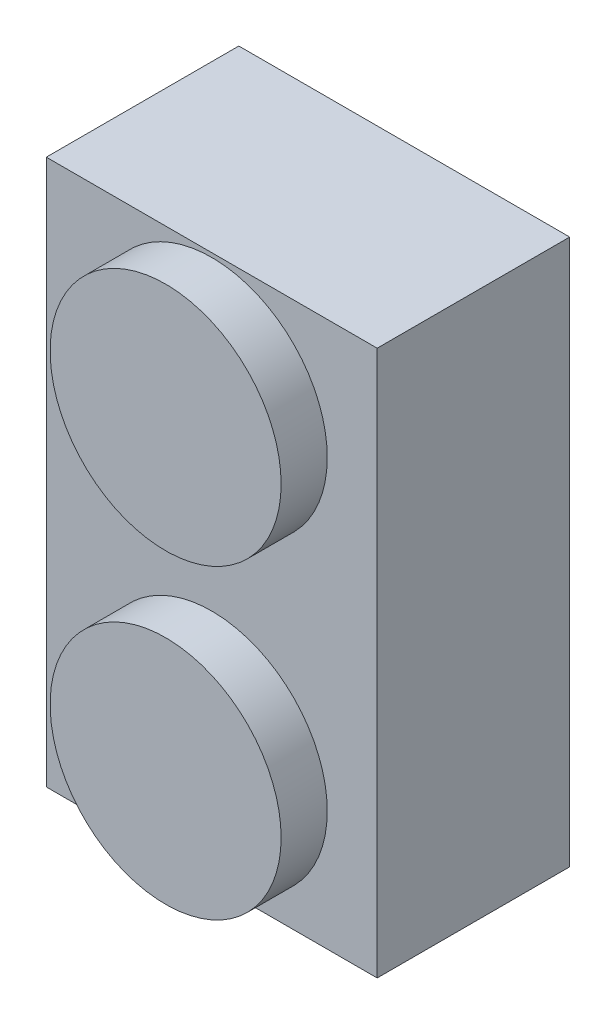
ISO-10303-21;
HEADER;
FILE_DESCRIPTION(('STEP AP214'),'2;1');
FILE_NAME('part.step','',(''),(''),'','','');
FILE_SCHEMA(('AUTOMOTIVE_DESIGN { 1 0 10303 214 1 1 1 1 }'));
ENDSEC;
DATA;
#1=APPLICATION_CONTEXT('core data for automotive mechanical design processes');
#2=APPLICATION_PROTOCOL_DEFINITION('international standard','automotive_design',2000,#1);
#3=PRODUCT_CONTEXT('',#1,'mechanical');
#4=PRODUCT('Part','Part','',(#3));
#5=PRODUCT_RELATED_PRODUCT_CATEGORY('part','',(#4));
#6=PRODUCT_DEFINITION_FORMATION('','',#4);
#7=PRODUCT_DEFINITION_CONTEXT('part definition',#1,'design');
#8=PRODUCT_DEFINITION('design','',#6,#7);
#9=PRODUCT_DEFINITION_SHAPE('','',#8);
#10=(LENGTH_UNIT() NAMED_UNIT(*) SI_UNIT(.MILLI.,.METRE.));
#11=(NAMED_UNIT(*) PLANE_ANGLE_UNIT() SI_UNIT($,.RADIAN.));
#12=(NAMED_UNIT(*) SI_UNIT($,.STERADIAN.) SOLID_ANGLE_UNIT());
#13=UNCERTAINTY_MEASURE_WITH_UNIT(LENGTH_MEASURE(1.E-05),#10,'distance_accuracy_value','');
#14=(GEOMETRIC_REPRESENTATION_CONTEXT(3) GLOBAL_UNCERTAINTY_ASSIGNED_CONTEXT((#13)) GLOBAL_UNIT_ASSIGNED_CONTEXT((#10,
#11,#12)) REPRESENTATION_CONTEXT('',''));
#15=CARTESIAN_POINT('',(0.,0.,0.));
#16=DIRECTION('',(0.,0.,1.));
#17=DIRECTION('',(1.,0.,0.));
#18=AXIS2_PLACEMENT_3D('',#15,#16,#17);
#19=CARTESIAN_POINT('',(0.,0.,30.226));
#20=DIRECTION('',(0.,0.,1.));
#21=DIRECTION('',(1.,0.,0.));
#22=AXIS2_PLACEMENT_3D('',#19,#20,#21);
#23=PLANE('',#22);
#24=CARTESIAN_POINT('',(20.955,53.9369,30.226));
#25=DIRECTION('',(0.,0.,1.));
#26=DIRECTION('',(1.,0.,0.));
#27=AXIS2_PLACEMENT_3D('',#24,#25,#26);
#28=CIRCLE('',#27,14.6304);
#29=CARTESIAN_POINT('',(35.5854,53.9369,30.226));
#30=VERTEX_POINT('',#29);
#31=EDGE_CURVE('E20',#30,#30,#28,.F.);
#32=ORIENTED_EDGE('',*,*,#31,.F.);
#33=EDGE_LOOP('',(#32));
#34=FACE_BOUND('',#33,.T.);
#35=ADVANCED_FACE('F17',(#34),#23,.T.);
#36=CARTESIAN_POINT('',(0.,0.,30.226));
#37=DIRECTION('',(0.,0.,1.));
#38=DIRECTION('',(1.,0.,0.));
#39=AXIS2_PLACEMENT_3D('',#36,#37,#38);
#40=PLANE('',#39);
#41=CARTESIAN_POINT('',(20.955,15.1511,30.226));
#42=DIRECTION('',(0.,0.,1.));
#43=DIRECTION('',(1.,0.,0.));
#44=AXIS2_PLACEMENT_3D('',#41,#42,#43);
#45=CIRCLE('',#44,14.6304);
#46=CARTESIAN_POINT('',(35.5854,15.1511,30.226));
#47=VERTEX_POINT('',#46);
#48=EDGE_CURVE('E88',#47,#47,#45,.F.);
#49=ORIENTED_EDGE('',*,*,#48,.F.);
#50=EDGE_LOOP('',(#49));
#51=FACE_BOUND('',#50,.T.);
#52=ADVANCED_FACE('F99',(#51),#40,.T.);
#53=CARTESIAN_POINT('',(20.955,53.9369,24.384));
#54=DIRECTION('',(0.,0.,1.));
#55=DIRECTION('',(1.,0.,0.));
#56=AXIS2_PLACEMENT_3D('',#53,#54,#55);
#57=CYLINDRICAL_SURFACE('',#56,14.6304);
#58=ORIENTED_EDGE('',*,*,#31,.T.);
#59=EDGE_LOOP('',(#58));
#60=FACE_BOUND('',#59,.T.);
#61=CARTESIAN_POINT('',(20.955,53.9369,24.384));
#62=DIRECTION('',(0.,0.,1.));
#63=DIRECTION('',(1.,0.,0.));
#64=AXIS2_PLACEMENT_3D('',#61,#62,#63);
#65=CIRCLE('',#64,14.6304);
#66=CARTESIAN_POINT('',(35.5854,53.9369,24.384));
#67=VERTEX_POINT('',#66);
#68=EDGE_CURVE('E86',#67,#67,#65,.F.);
#69=ORIENTED_EDGE('',*,*,#68,.F.);
#70=EDGE_LOOP('',(#69));
#71=FACE_BOUND('',#70,.T.);
#72=ADVANCED_FACE('F95',(#60,#71),#57,.T.);
#73=CARTESIAN_POINT('',(20.955,15.1511,24.384));
#74=DIRECTION('',(0.,0.,1.));
#75=DIRECTION('',(1.,0.,0.));
#76=AXIS2_PLACEMENT_3D('',#73,#74,#75);
#77=CYLINDRICAL_SURFACE('',#76,14.6304);
#78=ORIENTED_EDGE('',*,*,#48,.T.);
#79=EDGE_LOOP('',(#78));
#80=FACE_BOUND('',#79,.T.);
#81=CARTESIAN_POINT('',(20.955,15.1511,24.384));
#82=DIRECTION('',(0.,0.,1.));
#83=DIRECTION('',(1.,0.,0.));
#84=AXIS2_PLACEMENT_3D('',#81,#82,#83);
#85=CIRCLE('',#84,14.6304);
#86=CARTESIAN_POINT('',(35.5854,15.1511,24.384));
#87=VERTEX_POINT('',#86);
#88=EDGE_CURVE('E75',#87,#87,#85,.F.);
#89=ORIENTED_EDGE('',*,*,#88,.F.);
#90=EDGE_LOOP('',(#89));
#91=FACE_BOUND('',#90,.T.);
#92=ADVANCED_FACE('F125',(#80,#91),#77,.T.);
#93=CARTESIAN_POINT('',(0.,0.,24.384));
#94=DIRECTION('',(0.,0.,1.));
#95=DIRECTION('',(1.,0.,0.));
#96=AXIS2_PLACEMENT_3D('',#93,#94,#95);
#97=PLANE('',#96);
#98=ORIENTED_EDGE('',*,*,#88,.T.);
#99=EDGE_LOOP('',(#98));
#100=FACE_BOUND('',#99,.T.);
#101=ORIENTED_EDGE('',*,*,#68,.T.);
#102=EDGE_LOOP('',(#101));
#103=FACE_BOUND('',#102,.T.);
#104=DIRECTION('',(1.,0.,0.));
#105=VECTOR('',#104,1.);
#106=CARTESIAN_POINT('',(41.91,69.088,24.384));
#107=LINE('',#106,#105);
#108=CARTESIAN_POINT('',(0.,69.088,24.384));
#109=VERTEX_POINT('',#108);
#110=CARTESIAN_POINT('',(41.91,69.088,24.384));
#111=VERTEX_POINT('',#110);
#112=EDGE_CURVE('E71',#109,#111,#107,.T.);
#113=ORIENTED_EDGE('',*,*,#112,.F.);
#114=DIRECTION('',(0.,1.,0.));
#115=VECTOR('',#114,1.);
#116=CARTESIAN_POINT('',(0.,69.088,24.384));
#117=LINE('',#116,#115);
#118=CARTESIAN_POINT('',(0.,0.,24.384));
#119=VERTEX_POINT('',#118);
#120=EDGE_CURVE('E67',#119,#109,#117,.T.);
#121=ORIENTED_EDGE('',*,*,#120,.F.);
#122=DIRECTION('',(1.,0.,0.));
#123=VECTOR('',#122,1.);
#124=CARTESIAN_POINT('',(0.,0.,24.384));
#125=LINE('',#124,#123);
#126=CARTESIAN_POINT('',(41.91,0.,24.384));
#127=VERTEX_POINT('',#126);
#128=EDGE_CURVE('E58',#127,#119,#125,.F.);
#129=ORIENTED_EDGE('',*,*,#128,.F.);
#130=DIRECTION('',(0.,1.,0.));
#131=VECTOR('',#130,1.);
#132=CARTESIAN_POINT('',(41.91,0.,24.384));
#133=LINE('',#132,#131);
#134=EDGE_CURVE('E53',#111,#127,#133,.F.);
#135=ORIENTED_EDGE('',*,*,#134,.F.);
#136=EDGE_LOOP('',(#113,#121,#129,#135));
#137=FACE_BOUND('',#136,.T.);
#138=ADVANCED_FACE('F70',(#100,#103,#137),#97,.T.);
#139=CARTESIAN_POINT('',(0.,69.088,0.));
#140=DIRECTION('',(-1.,0.,0.));
#141=DIRECTION('',(0.,0.,1.));
#142=AXIS2_PLACEMENT_3D('',#139,#140,#141);
#143=PLANE('',#142);
#144=DIRECTION('',(0.,0.,1.));
#145=VECTOR('',#144,1.);
#146=CARTESIAN_POINT('',(0.,69.088,0.));
#147=LINE('',#146,#145);
#148=CARTESIAN_POINT('',(0.,69.088,0.));
#149=VERTEX_POINT('',#148);
#150=EDGE_CURVE('E213',#149,#109,#147,.T.);
#151=ORIENTED_EDGE('',*,*,#150,.F.);
#152=DIRECTION('',(0.,1.,0.));
#153=VECTOR('',#152,1.);
#154=CARTESIAN_POINT('',(0.,0.,0.));
#155=LINE('',#154,#153);
#156=CARTESIAN_POINT('',(0.,0.,0.));
#157=VERTEX_POINT('',#156);
#158=EDGE_CURVE('E79',#149,#157,#155,.F.);
#159=ORIENTED_EDGE('',*,*,#158,.T.);
#160=DIRECTION('',(0.,0.,-1.));
#161=VECTOR('',#160,1.);
#162=CARTESIAN_POINT('',(0.,0.,0.));
#163=LINE('',#162,#161);
#164=EDGE_CURVE('E63',#119,#157,#163,.T.);
#165=ORIENTED_EDGE('',*,*,#164,.F.);
#166=ORIENTED_EDGE('',*,*,#120,.T.);
#167=EDGE_LOOP('',(#151,#159,#165,#166));
#168=FACE_BOUND('',#167,.T.);
#169=ADVANCED_FACE('F78',(#168),#143,.T.);
#170=CARTESIAN_POINT('',(0.,0.,0.));
#171=DIRECTION('',(0.,-1.,0.));
#172=DIRECTION('',(0.,0.,-1.));
#173=AXIS2_PLACEMENT_3D('',#170,#171,#172);
#174=PLANE('',#173);
#175=ORIENTED_EDGE('',*,*,#164,.T.);
#176=DIRECTION('',(1.,0.,0.));
#177=VECTOR('',#176,1.);
#178=CARTESIAN_POINT('',(0.,0.,0.));
#179=LINE('',#178,#177);
#180=CARTESIAN_POINT('',(41.91,0.,0.));
#181=VERTEX_POINT('',#180);
#182=EDGE_CURVE('E214',#157,#181,#179,.T.);
#183=ORIENTED_EDGE('',*,*,#182,.T.);
#184=DIRECTION('',(0.,0.,-1.));
#185=VECTOR('',#184,1.);
#186=CARTESIAN_POINT('',(41.91,0.,0.));
#187=LINE('',#186,#185);
#188=EDGE_CURVE('E65',#127,#181,#187,.T.);
#189=ORIENTED_EDGE('',*,*,#188,.F.);
#190=ORIENTED_EDGE('',*,*,#128,.T.);
#191=EDGE_LOOP('',(#175,#183,#189,#190));
#192=FACE_BOUND('',#191,.T.);
#193=ADVANCED_FACE('F60',(#192),#174,.T.);
#194=CARTESIAN_POINT('',(41.91,0.,0.));
#195=DIRECTION('',(1.,0.,0.));
#196=DIRECTION('',(0.,0.,-1.));
#197=AXIS2_PLACEMENT_3D('',#194,#195,#196);
#198=PLANE('',#197);
#199=ORIENTED_EDGE('',*,*,#188,.T.);
#200=DIRECTION('',(0.,1.,0.));
#201=VECTOR('',#200,1.);
#202=CARTESIAN_POINT('',(41.91,0.,0.));
#203=LINE('',#202,#201);
#204=CARTESIAN_POINT('',(41.91,69.088,0.));
#205=VERTEX_POINT('',#204);
#206=EDGE_CURVE('E26',#181,#205,#203,.T.);
#207=ORIENTED_EDGE('',*,*,#206,.T.);
#208=DIRECTION('',(0.,0.,1.));
#209=VECTOR('',#208,1.);
#210=CARTESIAN_POINT('',(41.91,69.088,0.));
#211=LINE('',#210,#209);
#212=EDGE_CURVE('E34',#111,#205,#211,.F.);
#213=ORIENTED_EDGE('',*,*,#212,.F.);
#214=ORIENTED_EDGE('',*,*,#134,.T.);
#215=EDGE_LOOP('',(#199,#207,#213,#214));
#216=FACE_BOUND('',#215,.T.);
#217=ADVANCED_FACE('F113',(#216),#198,.T.);
#218=CARTESIAN_POINT('',(41.91,69.088,0.));
#219=DIRECTION('',(0.,1.,0.));
#220=DIRECTION('',(0.,0.,1.));
#221=AXIS2_PLACEMENT_3D('',#218,#219,#220);
#222=PLANE('',#221);
#223=ORIENTED_EDGE('',*,*,#212,.T.);
#224=DIRECTION('',(1.,0.,0.));
#225=VECTOR('',#224,1.);
#226=CARTESIAN_POINT('',(0.,69.088,0.));
#227=LINE('',#226,#225);
#228=EDGE_CURVE('E11',#205,#149,#227,.F.);
#229=ORIENTED_EDGE('',*,*,#228,.T.);
#230=ORIENTED_EDGE('',*,*,#150,.T.);
#231=ORIENTED_EDGE('',*,*,#112,.T.);
#232=EDGE_LOOP('',(#223,#229,#230,#231));
#233=FACE_BOUND('',#232,.T.);
#234=ADVANCED_FACE('F107',(#233),#222,.T.);
#235=CARTESIAN_POINT('',(0.,0.,0.));
#236=DIRECTION('',(0.,0.,1.));
#237=DIRECTION('',(1.,0.,0.));
#238=AXIS2_PLACEMENT_3D('',#235,#236,#237);
#239=PLANE('',#238);
#240=ORIENTED_EDGE('',*,*,#206,.F.);
#241=ORIENTED_EDGE('',*,*,#182,.F.);
#242=ORIENTED_EDGE('',*,*,#158,.F.);
#243=ORIENTED_EDGE('',*,*,#228,.F.);
#244=EDGE_LOOP('',(#240,#241,#242,#243));
#245=FACE_BOUND('',#244,.T.);
#246=ADVANCED_FACE('F105',(#245),#239,.F.);
#247=CLOSED_SHELL('',(#35,#52,#72,#92,#138,#169,#193,#217,#234,#246));
#248=MANIFOLD_SOLID_BREP('B1',#247);
#249=ADVANCED_BREP_SHAPE_REPRESENTATION('',(#18,#248),#14);
#250=SHAPE_DEFINITION_REPRESENTATION(#9,#249);
ENDSEC;
END-ISO-10303-21;
